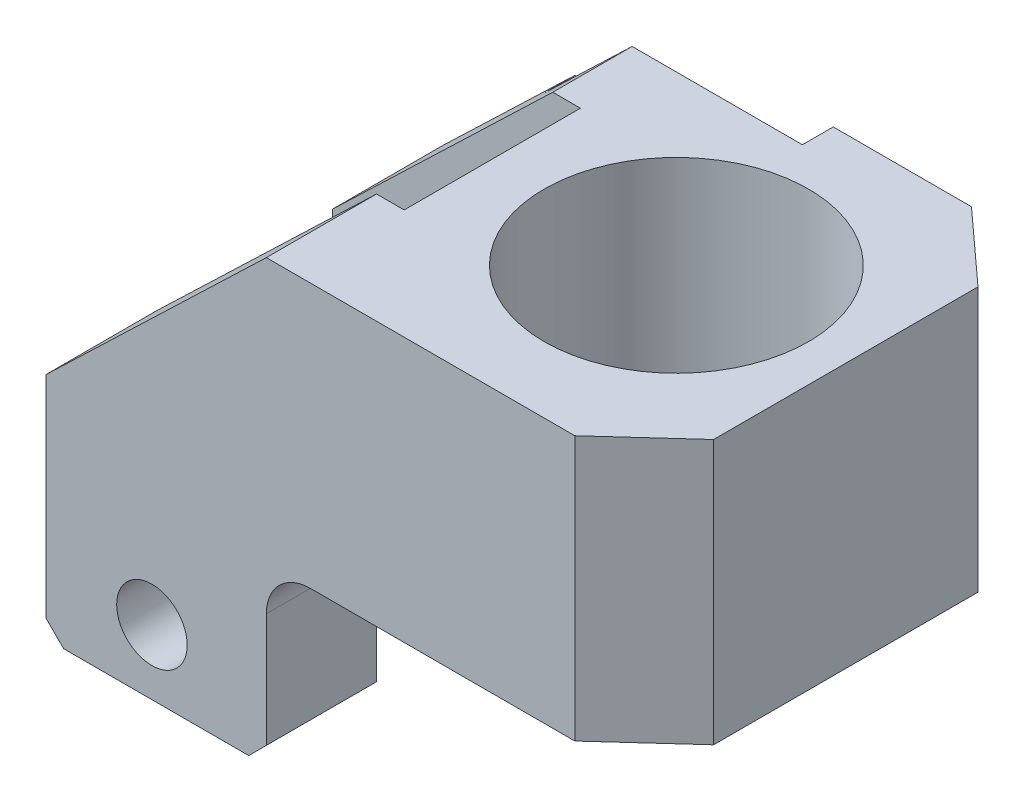
ISO-10303-21;
HEADER;
FILE_DESCRIPTION(('STEP AP214'),'2;1');
FILE_NAME('part.step','',(''),(''),'','','');
FILE_SCHEMA(('AUTOMOTIVE_DESIGN { 1 0 10303 214 1 1 1 1 }'));
ENDSEC;
DATA;
#1=APPLICATION_CONTEXT('core data for automotive mechanical design processes');
#2=APPLICATION_PROTOCOL_DEFINITION('international standard','automotive_design',2000,#1);
#3=PRODUCT_CONTEXT('',#1,'mechanical');
#4=PRODUCT('Part','Part','',(#3));
#5=PRODUCT_RELATED_PRODUCT_CATEGORY('part','',(#4));
#6=PRODUCT_DEFINITION_FORMATION('','',#4);
#7=PRODUCT_DEFINITION_CONTEXT('part definition',#1,'design');
#8=PRODUCT_DEFINITION('design','',#6,#7);
#9=PRODUCT_DEFINITION_SHAPE('','',#8);
#10=(LENGTH_UNIT() NAMED_UNIT(*) SI_UNIT(.MILLI.,.METRE.));
#11=(NAMED_UNIT(*) PLANE_ANGLE_UNIT() SI_UNIT($,.RADIAN.));
#12=(NAMED_UNIT(*) SI_UNIT($,.STERADIAN.) SOLID_ANGLE_UNIT());
#13=UNCERTAINTY_MEASURE_WITH_UNIT(LENGTH_MEASURE(1.E-05),#10,'distance_accuracy_value','');
#14=(GEOMETRIC_REPRESENTATION_CONTEXT(3) GLOBAL_UNCERTAINTY_ASSIGNED_CONTEXT((#13)) GLOBAL_UNIT_ASSIGNED_CONTEXT((#10,
#11,#12)) REPRESENTATION_CONTEXT('',''));
#15=CARTESIAN_POINT('',(0.,0.,0.));
#16=DIRECTION('',(0.,0.,1.));
#17=DIRECTION('',(1.,0.,0.));
#18=AXIS2_PLACEMENT_3D('',#15,#16,#17);
#19=CARTESIAN_POINT('',(-24.019063341913,30.,22.5));
#20=DIRECTION('',(-0.692343128271986,0.721568425538812,0.));
#21=DIRECTION('',(-0.721568425538812,-0.692343128271986,0.));
#22=AXIS2_PLACEMENT_3D('',#19,#20,#21);
#23=PLANE('',#22);
#24=DIRECTION('',(0.721568425538812,0.692343128271986,0.));
#25=VECTOR('',#24,1.);
#26=CARTESIAN_POINT('',(-24.019063341913,30.,10.));
#27=LINE('',#26,#25);
#28=CARTESIAN_POINT('',(-49.019063341913,6.01256153375207,10.));
#29=VERTEX_POINT('',#28);
#30=CARTESIAN_POINT('',(-24.019063341913,30.,10.));
#31=VERTEX_POINT('',#30);
#32=EDGE_CURVE('E338',#29,#31,#27,.T.);
#33=ORIENTED_EDGE('',*,*,#32,.F.);
#34=DIRECTION('',(0.,0.,-1.));
#35=VECTOR('',#34,1.);
#36=CARTESIAN_POINT('',(-49.019063341913,6.01256153375207,22.5));
#37=LINE('',#36,#35);
#38=CARTESIAN_POINT('',(-49.019063341913,6.01256153375207,22.5));
#39=VERTEX_POINT('',#38);
#40=EDGE_CURVE('E373',#39,#29,#37,.T.);
#41=ORIENTED_EDGE('',*,*,#40,.F.);
#42=DIRECTION('',(0.721568425538812,0.692343128271986,0.));
#43=VECTOR('',#42,1.);
#44=CARTESIAN_POINT('',(-24.019063341913,30.,22.5));
#45=LINE('',#44,#43);
#46=CARTESIAN_POINT('',(-24.019063341913,30.,22.5));
#47=VERTEX_POINT('',#46);
#48=EDGE_CURVE('E346',#39,#47,#45,.T.);
#49=ORIENTED_EDGE('',*,*,#48,.T.);
#50=DIRECTION('',(0.,0.,1.));
#51=VECTOR('',#50,1.);
#52=CARTESIAN_POINT('',(-24.019063341913,30.,-22.5));
#53=LINE('',#52,#51);
#54=EDGE_CURVE('E208',#31,#47,#53,.T.);
#55=ORIENTED_EDGE('',*,*,#54,.F.);
#56=EDGE_LOOP('',(#33,#41,#49,#55));
#57=FACE_BOUND('',#56,.T.);
#58=ADVANCED_FACE('F30',(#57),#23,.T.);
#59=CARTESIAN_POINT('',(-49.019063341913,-19.9275306984768,22.5));
#60=DIRECTION('',(-1.,0.,0.));
#61=DIRECTION('',(0.,0.,1.));
#62=AXIS2_PLACEMENT_3D('',#59,#60,#61);
#63=PLANE('',#62);
#64=DIRECTION('',(0.,1.,0.));
#65=VECTOR('',#64,1.);
#66=CARTESIAN_POINT('',(-49.019063341913,-19.9275306984768,10.));
#67=LINE('',#66,#65);
#68=CARTESIAN_POINT('',(-49.019063341913,-17.9275306984768,10.));
#69=VERTEX_POINT('',#68);
#70=EDGE_CURVE('E336',#69,#29,#67,.T.);
#71=ORIENTED_EDGE('',*,*,#70,.F.);
#72=DIRECTION('',(0.,0.,1.));
#73=VECTOR('',#72,1.);
#74=CARTESIAN_POINT('',(-49.019063341913,-17.9275306984768,22.5));
#75=LINE('',#74,#73);
#76=CARTESIAN_POINT('',(-49.019063341913,-17.9275306984768,22.5));
#77=VERTEX_POINT('',#76);
#78=EDGE_CURVE('E52',#69,#77,#75,.T.);
#79=ORIENTED_EDGE('',*,*,#78,.T.);
#80=DIRECTION('',(0.,1.,0.));
#81=VECTOR('',#80,1.);
#82=CARTESIAN_POINT('',(-49.019063341913,-19.9275306984768,22.5));
#83=LINE('',#82,#81);
#84=EDGE_CURVE('E430',#77,#39,#83,.T.);
#85=ORIENTED_EDGE('',*,*,#84,.T.);
#86=ORIENTED_EDGE('',*,*,#40,.T.);
#87=EDGE_LOOP('',(#71,#79,#85,#86));
#88=FACE_BOUND('',#87,.T.);
#89=ADVANCED_FACE('F447',(#88),#63,.T.);
#90=CARTESIAN_POINT('',(-49.019063341913,-19.9275306984768,22.5));
#91=DIRECTION('',(0.,-1.,0.));
#92=DIRECTION('',(0.,0.,-1.));
#93=AXIS2_PLACEMENT_3D('',#90,#91,#92);
#94=PLANE('',#93);
#95=DIRECTION('',(-1.,0.,0.));
#96=VECTOR('',#95,1.);
#97=CARTESIAN_POINT('',(-49.019063341913,-19.9275306984768,10.));
#98=LINE('',#97,#96);
#99=CARTESIAN_POINT('',(-26.019063341913,-19.9275306984768,10.));
#100=VERTEX_POINT('',#99);
#101=CARTESIAN_POINT('',(-47.019063341913,-19.9275306984768,10.));
#102=VERTEX_POINT('',#101);
#103=EDGE_CURVE('E333',#100,#102,#98,.T.);
#104=ORIENTED_EDGE('',*,*,#103,.F.);
#105=DIRECTION('',(0.,0.,1.));
#106=VECTOR('',#105,1.);
#107=CARTESIAN_POINT('',(-26.019063341913,-19.9275306984768,22.5));
#108=LINE('',#107,#106);
#109=CARTESIAN_POINT('',(-26.019063341913,-19.9275306984768,22.5));
#110=VERTEX_POINT('',#109);
#111=EDGE_CURVE('E289',#100,#110,#108,.T.);
#112=ORIENTED_EDGE('',*,*,#111,.T.);
#113=DIRECTION('',(-1.,0.,0.));
#114=VECTOR('',#113,1.);
#115=CARTESIAN_POINT('',(-49.019063341913,-19.9275306984768,22.5));
#116=LINE('',#115,#114);
#117=CARTESIAN_POINT('',(-47.019063341913,-19.9275306984768,22.5));
#118=VERTEX_POINT('',#117);
#119=EDGE_CURVE('E353',#110,#118,#116,.T.);
#120=ORIENTED_EDGE('',*,*,#119,.T.);
#121=DIRECTION('',(0.,0.,-1.));
#122=VECTOR('',#121,1.);
#123=CARTESIAN_POINT('',(-47.019063341913,-19.9275306984768,22.5));
#124=LINE('',#123,#122);
#125=EDGE_CURVE('E286',#118,#102,#124,.T.);
#126=ORIENTED_EDGE('',*,*,#125,.T.);
#127=EDGE_LOOP('',(#104,#112,#120,#126));
#128=FACE_BOUND('',#127,.T.);
#129=ADVANCED_FACE('F437',(#128),#94,.T.);
#130=CARTESIAN_POINT('',(-24.019063341913,-19.9275306984768,22.5));
#131=DIRECTION('',(1.,0.,0.));
#132=DIRECTION('',(0.,0.,-1.));
#133=AXIS2_PLACEMENT_3D('',#130,#131,#132);
#134=PLANE('',#133);
#135=DIRECTION('',(0.,-1.,0.));
#136=VECTOR('',#135,1.);
#137=CARTESIAN_POINT('',(-24.019063341913,-19.9275306984768,22.5));
#138=LINE('',#137,#136);
#139=CARTESIAN_POINT('',(-24.019063341913,-5.,22.5));
#140=VERTEX_POINT('',#139);
#141=CARTESIAN_POINT('',(-24.019063341913,-17.9275306984768,22.5));
#142=VERTEX_POINT('',#141);
#143=EDGE_CURVE('E349',#140,#142,#138,.T.);
#144=ORIENTED_EDGE('',*,*,#143,.T.);
#145=DIRECTION('',(0.,0.,-1.));
#146=VECTOR('',#145,1.);
#147=CARTESIAN_POINT('',(-24.019063341913,-17.9275306984768,22.5));
#148=LINE('',#147,#146);
#149=CARTESIAN_POINT('',(-24.019063341913,-17.9275306984768,10.));
#150=VERTEX_POINT('',#149);
#151=EDGE_CURVE('E279',#142,#150,#148,.T.);
#152=ORIENTED_EDGE('',*,*,#151,.T.);
#153=DIRECTION('',(0.,-1.,0.));
#154=VECTOR('',#153,1.);
#155=CARTESIAN_POINT('',(-24.019063341913,-19.9275306984768,10.));
#156=LINE('',#155,#154);
#157=CARTESIAN_POINT('',(-24.019063341913,-5.,10.));
#158=VERTEX_POINT('',#157);
#159=EDGE_CURVE('E360',#158,#150,#156,.T.);
#160=ORIENTED_EDGE('',*,*,#159,.F.);
#161=DIRECTION('',(0.,0.,-1.));
#162=VECTOR('',#161,1.);
#163=CARTESIAN_POINT('',(-24.019063341913,-5.,16.25));
#164=LINE('',#163,#162);
#165=EDGE_CURVE('E247',#158,#140,#164,.F.);
#166=ORIENTED_EDGE('',*,*,#165,.T.);
#167=EDGE_LOOP('',(#144,#152,#160,#166));
#168=FACE_BOUND('',#167,.T.);
#169=ADVANCED_FACE('F460',(#168),#134,.T.);
#170=CARTESIAN_POINT('',(10.9809366580871,30.,22.5));
#171=DIRECTION('',(-0.67300654170394,0.,-0.739636528859752));
#172=DIRECTION('',(-0.739636528859752,0.,0.67300654170394));
#173=AXIS2_PLACEMENT_3D('',#170,#171,#172);
#174=PLANE('',#173);
#175=DIRECTION('',(0.739636528859752,0.,-0.67300654170394));
#176=VECTOR('',#175,1.);
#177=CARTESIAN_POINT('',(10.9809366580871,0.,22.5));
#178=LINE('',#177,#176);
#179=CARTESIAN_POINT('',(10.9809366580871,0.,22.5));
#180=VERTEX_POINT('',#179);
#181=CARTESIAN_POINT('',(19.2234627298298,0.,15.));
#182=VERTEX_POINT('',#181);
#183=EDGE_CURVE('E219',#180,#182,#178,.T.);
#184=ORIENTED_EDGE('',*,*,#183,.T.);
#185=DIRECTION('',(0.,-1.,0.));
#186=VECTOR('',#185,1.);
#187=CARTESIAN_POINT('',(19.2234627298298,30.,15.));
#188=LINE('',#187,#186);
#189=CARTESIAN_POINT('',(19.2234627298298,30.,15.));
#190=VERTEX_POINT('',#189);
#191=EDGE_CURVE('E235',#190,#182,#188,.T.);
#192=ORIENTED_EDGE('',*,*,#191,.F.);
#193=DIRECTION('',(0.739636528859752,0.,-0.67300654170394));
#194=VECTOR('',#193,1.);
#195=CARTESIAN_POINT('',(10.9809366580871,30.,22.5));
#196=LINE('',#195,#194);
#197=CARTESIAN_POINT('',(10.9809366580871,30.,22.5));
#198=VERTEX_POINT('',#197);
#199=EDGE_CURVE('E246',#198,#190,#196,.T.);
#200=ORIENTED_EDGE('',*,*,#199,.F.);
#201=DIRECTION('',(0.,-1.,0.));
#202=VECTOR('',#201,1.);
#203=CARTESIAN_POINT('',(10.9809366580871,30.,22.5));
#204=LINE('',#203,#202);
#205=EDGE_CURVE('E218',#198,#180,#204,.T.);
#206=ORIENTED_EDGE('',*,*,#205,.T.);
#207=EDGE_LOOP('',(#184,#192,#200,#206));
#208=FACE_BOUND('',#207,.T.);
#209=ADVANCED_FACE('F517',(#208),#174,.F.);
#210=CARTESIAN_POINT('',(19.2234627298298,30.,-15.));
#211=DIRECTION('',(-1.,0.,0.));
#212=DIRECTION('',(0.,0.,1.));
#213=AXIS2_PLACEMENT_3D('',#210,#211,#212);
#214=PLANE('',#213);
#215=DIRECTION('',(0.,0.,-1.));
#216=VECTOR('',#215,1.);
#217=CARTESIAN_POINT('',(19.2234627298298,0.,-15.));
#218=LINE('',#217,#216);
#219=CARTESIAN_POINT('',(19.2234627298298,0.,-15.));
#220=VERTEX_POINT('',#219);
#221=EDGE_CURVE('E222',#182,#220,#218,.T.);
#222=ORIENTED_EDGE('',*,*,#221,.T.);
#223=DIRECTION('',(0.,-1.,0.));
#224=VECTOR('',#223,1.);
#225=CARTESIAN_POINT('',(19.2234627298298,30.,-15.));
#226=LINE('',#225,#224);
#227=CARTESIAN_POINT('',(19.2234627298298,30.,-15.));
#228=VERTEX_POINT('',#227);
#229=EDGE_CURVE('E232',#228,#220,#226,.T.);
#230=ORIENTED_EDGE('',*,*,#229,.F.);
#231=DIRECTION('',(0.,0.,-1.));
#232=VECTOR('',#231,1.);
#233=CARTESIAN_POINT('',(19.2234627298298,30.,-15.));
#234=LINE('',#233,#232);
#235=EDGE_CURVE('E212',#190,#228,#234,.T.);
#236=ORIENTED_EDGE('',*,*,#235,.F.);
#237=ORIENTED_EDGE('',*,*,#191,.T.);
#238=EDGE_LOOP('',(#222,#230,#236,#237));
#239=FACE_BOUND('',#238,.T.);
#240=ADVANCED_FACE('F387',(#239),#214,.F.);
#241=CARTESIAN_POINT('',(10.9809366580871,30.,-22.5));
#242=DIRECTION('',(-0.67300654170394,0.,0.739636528859752));
#243=DIRECTION('',(0.739636528859752,0.,0.67300654170394));
#244=AXIS2_PLACEMENT_3D('',#241,#242,#243);
#245=PLANE('',#244);
#246=DIRECTION('',(-0.739636528859752,0.,-0.67300654170394));
#247=VECTOR('',#246,1.);
#248=CARTESIAN_POINT('',(10.9809366580871,0.,-22.5));
#249=LINE('',#248,#247);
#250=CARTESIAN_POINT('',(10.9809366580871,0.,-22.5));
#251=VERTEX_POINT('',#250);
#252=EDGE_CURVE('E225',#220,#251,#249,.T.);
#253=ORIENTED_EDGE('',*,*,#252,.T.);
#254=DIRECTION('',(0.,-1.,0.));
#255=VECTOR('',#254,1.);
#256=CARTESIAN_POINT('',(10.9809366580871,30.,-22.5));
#257=LINE('',#256,#255);
#258=CARTESIAN_POINT('',(10.9809366580871,30.,-22.5));
#259=VERTEX_POINT('',#258);
#260=EDGE_CURVE('E230',#259,#251,#257,.T.);
#261=ORIENTED_EDGE('',*,*,#260,.F.);
#262=DIRECTION('',(-0.739636528859752,0.,-0.67300654170394));
#263=VECTOR('',#262,1.);
#264=CARTESIAN_POINT('',(10.9809366580871,30.,-22.5));
#265=LINE('',#264,#263);
#266=EDGE_CURVE('E206',#228,#259,#265,.T.);
#267=ORIENTED_EDGE('',*,*,#266,.F.);
#268=ORIENTED_EDGE('',*,*,#229,.T.);
#269=EDGE_LOOP('',(#253,#261,#267,#268));
#270=FACE_BOUND('',#269,.T.);
#271=ADVANCED_FACE('F390',(#270),#245,.F.);
#272=CARTESIAN_POINT('',(-24.019063341913,30.,-22.5));
#273=DIRECTION('',(0.,0.,1.));
#274=DIRECTION('',(1.,0.,0.));
#275=AXIS2_PLACEMENT_3D('',#272,#273,#274);
#276=PLANE('',#275);
#277=CARTESIAN_POINT('',(-37.0000000016137,-12.5783063820862,-22.5));
#278=DIRECTION('',(0.,0.,-1.));
#279=DIRECTION('',(-1.,0.,0.));
#280=AXIS2_PLACEMENT_3D('',#277,#278,#279);
#281=CIRCLE('',#280,3.99999999676854);
#282=CARTESIAN_POINT('',(-40.9999999983823,-12.5783063820862,-22.5));
#283=VERTEX_POINT('',#282);
#284=EDGE_CURVE('E192',#283,#283,#281,.T.);
#285=ORIENTED_EDGE('',*,*,#284,.F.);
#286=EDGE_LOOP('',(#285));
#287=FACE_BOUND('',#286,.T.);
#288=DIRECTION('',(0.721568425538812,0.692343128271986,0.));
#289=VECTOR('',#288,1.);
#290=CARTESIAN_POINT('',(-24.019063341913,30.,-22.5));
#291=LINE('',#290,#289);
#292=CARTESIAN_POINT('',(-49.019063341913,6.01256153375207,-22.5));
#293=VERTEX_POINT('',#292);
#294=CARTESIAN_POINT('',(-33.9839867005009,20.4386805645998,-22.5));
#295=VERTEX_POINT('',#294);
#296=EDGE_CURVE('E202',#293,#295,#291,.T.);
#297=ORIENTED_EDGE('',*,*,#296,.T.);
#298=CARTESIAN_POINT('',(-21.5760087804677,32.0594414663638,-22.5));
#299=DIRECTION('',(0.,0.,-1.));
#300=DIRECTION('',(-1.,0.,0.));
#301=AXIS2_PLACEMENT_3D('',#298,#299,#300);
#302=CIRCLE('',#301,17.);
#303=CARTESIAN_POINT('',(-4.70121394181491,30.,-22.5));
#304=VERTEX_POINT('',#303);
#305=EDGE_CURVE('E187',#304,#295,#302,.T.);
#306=ORIENTED_EDGE('',*,*,#305,.F.);
#307=DIRECTION('',(-1.,0.,0.));
#308=VECTOR('',#307,1.);
#309=CARTESIAN_POINT('',(-24.019063341913,30.,-22.5));
#310=LINE('',#309,#308);
#311=EDGE_CURVE('E200',#259,#304,#310,.T.);
#312=ORIENTED_EDGE('',*,*,#311,.F.);
#313=ORIENTED_EDGE('',*,*,#260,.T.);
#314=DIRECTION('',(-1.,0.,0.));
#315=VECTOR('',#314,1.);
#316=CARTESIAN_POINT('',(-24.019063341913,0.,-22.5));
#317=LINE('',#316,#315);
#318=CARTESIAN_POINT('',(-19.019063341913,0.,-22.5));
#319=VERTEX_POINT('',#318);
#320=EDGE_CURVE('E227',#251,#319,#317,.T.);
#321=ORIENTED_EDGE('',*,*,#320,.T.);
#322=CARTESIAN_POINT('',(-19.019063341913,-5.,-22.5));
#323=DIRECTION('',(0.,0.,1.));
#324=DIRECTION('',(1.,0.,0.));
#325=AXIS2_PLACEMENT_3D('',#322,#323,#324);
#326=CIRCLE('',#325,5.);
#327=CARTESIAN_POINT('',(-24.019063341913,-5.,-22.5));
#328=VERTEX_POINT('',#327);
#329=EDGE_CURVE('E261',#319,#328,#326,.T.);
#330=ORIENTED_EDGE('',*,*,#329,.T.);
#331=DIRECTION('',(0.,-1.,0.));
#332=VECTOR('',#331,1.);
#333=CARTESIAN_POINT('',(-24.019063341913,-19.9275306984768,-22.5));
#334=LINE('',#333,#332);
#335=CARTESIAN_POINT('',(-24.019063341913,-17.9275306984768,-22.5));
#336=VERTEX_POINT('',#335);
#337=EDGE_CURVE('E361',#328,#336,#334,.T.);
#338=ORIENTED_EDGE('',*,*,#337,.T.);
#339=DIRECTION('',(0.707106781186551,0.707106781186544,0.));
#340=VECTOR('',#339,1.);
#341=CARTESIAN_POINT('',(-24.019063341913,-17.9275306984768,-22.5));
#342=LINE('',#341,#340);
#343=CARTESIAN_POINT('',(-26.019063341913,-19.9275306984768,-22.5));
#344=VERTEX_POINT('',#343);
#345=EDGE_CURVE('E268',#336,#344,#342,.F.);
#346=ORIENTED_EDGE('',*,*,#345,.T.);
#347=DIRECTION('',(-1.,0.,0.));
#348=VECTOR('',#347,1.);
#349=CARTESIAN_POINT('',(-49.019063341913,-19.9275306984768,-22.5));
#350=LINE('',#349,#348);
#351=CARTESIAN_POINT('',(-47.019063341913,-19.9275306984768,-22.5));
#352=VERTEX_POINT('',#351);
#353=EDGE_CURVE('E365',#344,#352,#350,.T.);
#354=ORIENTED_EDGE('',*,*,#353,.T.);
#355=DIRECTION('',(0.707106781186545,-0.70710678118655,0.));
#356=VECTOR('',#355,1.);
#357=CARTESIAN_POINT('',(-47.019063341913,-19.9275306984768,-22.5));
#358=LINE('',#357,#356);
#359=CARTESIAN_POINT('',(-49.019063341913,-17.9275306984768,-22.5));
#360=VERTEX_POINT('',#359);
#361=EDGE_CURVE('E266',#352,#360,#358,.F.);
#362=ORIENTED_EDGE('',*,*,#361,.T.);
#363=DIRECTION('',(0.,1.,0.));
#364=VECTOR('',#363,1.);
#365=CARTESIAN_POINT('',(-49.019063341913,-19.9275306984768,-22.5));
#366=LINE('',#365,#364);
#367=EDGE_CURVE('E350',#360,#293,#366,.T.);
#368=ORIENTED_EDGE('',*,*,#367,.T.);
#369=EDGE_LOOP('',(#297,#306,#312,#313,#321,#330,#338,#346,#354,#362,#368));
#370=FACE_BOUND('',#369,.T.);
#371=ADVANCED_FACE('F198',(#287,#370),#276,.F.);
#372=CARTESIAN_POINT('',(-24.019063341913,30.,22.5));
#373=DIRECTION('',(0.,0.,-1.));
#374=DIRECTION('',(-1.,0.,0.));
#375=AXIS2_PLACEMENT_3D('',#372,#373,#374);
#376=PLANE('',#375);
#377=CARTESIAN_POINT('',(-37.0000000016137,-12.5783063820862,22.5));
#378=DIRECTION('',(0.,0.,-1.));
#379=DIRECTION('',(-1.,0.,0.));
#380=AXIS2_PLACEMENT_3D('',#377,#378,#379);
#381=CIRCLE('',#380,3.99999999676854);
#382=CARTESIAN_POINT('',(-40.9999999983823,-12.5783063820862,22.5));
#383=VERTEX_POINT('',#382);
#384=EDGE_CURVE('E314',#383,#383,#381,.T.);
#385=ORIENTED_EDGE('',*,*,#384,.T.);
#386=EDGE_LOOP('',(#385));
#387=FACE_BOUND('',#386,.T.);
#388=ORIENTED_EDGE('',*,*,#119,.F.);
#389=DIRECTION('',(-0.707106781186551,-0.707106781186544,0.));
#390=VECTOR('',#389,1.);
#391=CARTESIAN_POINT('',(-24.019063341913,-17.9275306984768,22.5));
#392=LINE('',#391,#390);
#393=EDGE_CURVE('E293',#110,#142,#392,.F.);
#394=ORIENTED_EDGE('',*,*,#393,.T.);
#395=ORIENTED_EDGE('',*,*,#143,.F.);
#396=CARTESIAN_POINT('',(-19.019063341913,-5.,22.5));
#397=DIRECTION('',(0.,0.,-1.));
#398=DIRECTION('',(-1.,0.,0.));
#399=AXIS2_PLACEMENT_3D('',#396,#397,#398);
#400=CIRCLE('',#399,5.);
#401=CARTESIAN_POINT('',(-19.019063341913,0.,22.5));
#402=VERTEX_POINT('',#401);
#403=EDGE_CURVE('E259',#140,#402,#400,.T.);
#404=ORIENTED_EDGE('',*,*,#403,.T.);
#405=DIRECTION('',(1.,0.,0.));
#406=VECTOR('',#405,1.);
#407=CARTESIAN_POINT('',(-24.019063341913,0.,22.5));
#408=LINE('',#407,#406);
#409=EDGE_CURVE('E243',#402,#180,#408,.T.);
#410=ORIENTED_EDGE('',*,*,#409,.T.);
#411=ORIENTED_EDGE('',*,*,#205,.F.);
#412=DIRECTION('',(1.,0.,0.));
#413=VECTOR('',#412,1.);
#414=CARTESIAN_POINT('',(-24.019063341913,30.,22.5));
#415=LINE('',#414,#413);
#416=EDGE_CURVE('E216',#47,#198,#415,.T.);
#417=ORIENTED_EDGE('',*,*,#416,.F.);
#418=ORIENTED_EDGE('',*,*,#48,.F.);
#419=ORIENTED_EDGE('',*,*,#84,.F.);
#420=DIRECTION('',(-0.707106781186545,0.70710678118655,0.));
#421=VECTOR('',#420,1.);
#422=CARTESIAN_POINT('',(-47.019063341913,-19.9275306984768,22.5));
#423=LINE('',#422,#421);
#424=EDGE_CURVE('E291',#77,#118,#423,.F.);
#425=ORIENTED_EDGE('',*,*,#424,.T.);
#426=EDGE_LOOP('',(#388,#394,#395,#404,#410,#411,#417,#418,#419,#425));
#427=FACE_BOUND('',#426,.T.);
#428=ADVANCED_FACE('F452',(#387,#427),#376,.F.);
#429=CARTESIAN_POINT('',(35.7085148733153,30.,0.));
#430=DIRECTION('',(0.,-1.,0.));
#431=DIRECTION('',(0.,0.,-1.));
#432=AXIS2_PLACEMENT_3D('',#429,#430,#431);
#433=PLANE('',#432);
#434=CARTESIAN_POINT('',(0.,30.,0.));
#435=DIRECTION('',(0.,1.,0.));
#436=DIRECTION('',(0.,0.,1.));
#437=AXIS2_PLACEMENT_3D('',#434,#435,#436);
#438=CIRCLE('',#437,15.);
#439=CARTESIAN_POINT('',(0.,30.,15.));
#440=VERTEX_POINT('',#439);
#441=EDGE_CURVE('E376',#440,#440,#438,.T.);
#442=ORIENTED_EDGE('',*,*,#441,.F.);
#443=EDGE_LOOP('',(#442));
#444=FACE_BOUND('',#443,.T.);
#445=ORIENTED_EDGE('',*,*,#311,.T.);
#446=DIRECTION('',(0.,0.,-1.));
#447=VECTOR('',#446,1.);
#448=CARTESIAN_POINT('',(-4.70121394181491,30.,-19.));
#449=LINE('',#448,#447);
#450=CARTESIAN_POINT('',(-4.70121394181491,30.,-19.));
#451=VERTEX_POINT('',#450);
#452=EDGE_CURVE('E184',#304,#451,#449,.F.);
#453=ORIENTED_EDGE('',*,*,#452,.T.);
#454=DIRECTION('',(1.,0.,0.));
#455=VECTOR('',#454,1.);
#456=CARTESIAN_POINT('',(35.7085148733153,30.,-19.));
#457=LINE('',#456,#455);
#458=CARTESIAN_POINT('',(-24.019063341913,30.,-19.));
#459=VERTEX_POINT('',#458);
#460=EDGE_CURVE('E193',#459,#451,#457,.T.);
#461=ORIENTED_EDGE('',*,*,#460,.F.);
#462=CARTESIAN_POINT('',(-24.019063341913,30.,-10.));
#463=VERTEX_POINT('',#462);
#464=EDGE_CURVE('E210',#459,#463,#53,.T.);
#465=ORIENTED_EDGE('',*,*,#464,.T.);
#466=DIRECTION('',(1.,0.,0.));
#467=VECTOR('',#466,1.);
#468=CARTESIAN_POINT('',(35.7085148733153,30.,-10.));
#469=LINE('',#468,#467);
#470=CARTESIAN_POINT('',(-20.8824295978616,30.,-10.));
#471=VERTEX_POINT('',#470);
#472=EDGE_CURVE('E331',#463,#471,#469,.T.);
#473=ORIENTED_EDGE('',*,*,#472,.T.);
#474=DIRECTION('',(0.,0.,1.));
#475=VECTOR('',#474,1.);
#476=CARTESIAN_POINT('',(-20.8824295978616,30.,0.));
#477=LINE('',#476,#475);
#478=CARTESIAN_POINT('',(-20.8824295978616,30.,10.));
#479=VERTEX_POINT('',#478);
#480=EDGE_CURVE('E343',#471,#479,#477,.T.);
#481=ORIENTED_EDGE('',*,*,#480,.T.);
#482=DIRECTION('',(-1.,0.,0.));
#483=VECTOR('',#482,1.);
#484=CARTESIAN_POINT('',(35.7085148733153,30.,10.));
#485=LINE('',#484,#483);
#486=EDGE_CURVE('E340',#479,#31,#485,.T.);
#487=ORIENTED_EDGE('',*,*,#486,.T.);
#488=ORIENTED_EDGE('',*,*,#54,.T.);
#489=ORIENTED_EDGE('',*,*,#416,.T.);
#490=ORIENTED_EDGE('',*,*,#199,.T.);
#491=ORIENTED_EDGE('',*,*,#235,.T.);
#492=ORIENTED_EDGE('',*,*,#266,.T.);
#493=EDGE_LOOP('',(#445,#453,#461,#465,#473,#481,#487,#488,#489,#490,#491,#492));
#494=FACE_BOUND('',#493,.T.);
#495=ADVANCED_FACE('F204',(#444,#494),#433,.F.);
#496=CARTESIAN_POINT('',(35.7085148733153,0.,0.));
#497=DIRECTION('',(0.,-1.,0.));
#498=DIRECTION('',(0.,0.,-1.));
#499=AXIS2_PLACEMENT_3D('',#496,#497,#498);
#500=PLANE('',#499);
#501=ORIENTED_EDGE('',*,*,#409,.F.);
#502=DIRECTION('',(0.,0.,1.));
#503=VECTOR('',#502,1.);
#504=CARTESIAN_POINT('',(-19.019063341913,0.,-22.5));
#505=LINE('',#504,#503);
#506=EDGE_CURVE('E249',#402,#319,#505,.F.);
#507=ORIENTED_EDGE('',*,*,#506,.T.);
#508=ORIENTED_EDGE('',*,*,#320,.F.);
#509=ORIENTED_EDGE('',*,*,#252,.F.);
#510=ORIENTED_EDGE('',*,*,#221,.F.);
#511=ORIENTED_EDGE('',*,*,#183,.F.);
#512=EDGE_LOOP('',(#501,#507,#508,#509,#510,#511));
#513=FACE_BOUND('',#512,.T.);
#514=CARTESIAN_POINT('',(0.,0.,0.));
#515=DIRECTION('',(0.,1.,0.));
#516=DIRECTION('',(0.,0.,1.));
#517=AXIS2_PLACEMENT_3D('',#514,#515,#516);
#518=CIRCLE('',#517,15.);
#519=CARTESIAN_POINT('',(0.,0.,15.));
#520=VERTEX_POINT('',#519);
#521=EDGE_CURVE('E223',#520,#520,#518,.T.);
#522=ORIENTED_EDGE('',*,*,#521,.T.);
#523=EDGE_LOOP('',(#522));
#524=FACE_BOUND('',#523,.T.);
#525=ADVANCED_FACE('F396',(#513,#524),#500,.T.);
#526=CARTESIAN_POINT('',(0.,0.,0.));
#527=DIRECTION('',(0.,1.,0.));
#528=DIRECTION('',(0.,0.,1.));
#529=AXIS2_PLACEMENT_3D('',#526,#527,#528);
#530=CYLINDRICAL_SURFACE('',#529,15.);
#531=ORIENTED_EDGE('',*,*,#521,.F.);
#532=EDGE_LOOP('',(#531));
#533=FACE_BOUND('',#532,.T.);
#534=ORIENTED_EDGE('',*,*,#441,.T.);
#535=EDGE_LOOP('',(#534));
#536=FACE_BOUND('',#535,.T.);
#537=ADVANCED_FACE('F491',(#533,#536),#530,.F.);
#538=DIRECTION('',(0.,0.,-1.));
#539=VECTOR('',#538,1.);
#540=CARTESIAN_POINT('',(-33.9839867005009,20.4386805645998,-19.));
#541=LINE('',#540,#539);
#542=CARTESIAN_POINT('',(-33.9839867005009,20.4386805645998,-19.));
#543=VERTEX_POINT('',#542);
#544=EDGE_CURVE('E11',#295,#543,#541,.F.);
#545=ORIENTED_EDGE('',*,*,#544,.F.);
#546=ORIENTED_EDGE('',*,*,#296,.F.);
#547=CARTESIAN_POINT('',(-49.019063341913,6.01256153375207,-10.));
#548=VERTEX_POINT('',#547);
#549=EDGE_CURVE('E377',#548,#293,#37,.T.);
#550=ORIENTED_EDGE('',*,*,#549,.F.);
#551=DIRECTION('',(-0.721568425538812,-0.692343128271986,0.));
#552=VECTOR('',#551,1.);
#553=CARTESIAN_POINT('',(-24.019063341913,30.,-10.));
#554=LINE('',#553,#552);
#555=EDGE_CURVE('E329',#463,#548,#554,.T.);
#556=ORIENTED_EDGE('',*,*,#555,.F.);
#557=ORIENTED_EDGE('',*,*,#464,.F.);
#558=DIRECTION('',(-0.721568425538812,-0.692343128271986,0.));
#559=VECTOR('',#558,1.);
#560=CARTESIAN_POINT('',(-24.019063341913,30.,-19.));
#561=LINE('',#560,#559);
#562=EDGE_CURVE('E38',#459,#543,#561,.T.);
#563=ORIENTED_EDGE('',*,*,#562,.T.);
#564=EDGE_LOOP('',(#545,#546,#550,#556,#557,#563));
#565=FACE_BOUND('',#564,.T.);
#566=ADVANCED_FACE('F300',(#565),#23,.T.);
#567=ORIENTED_EDGE('',*,*,#367,.F.);
#568=DIRECTION('',(0.,0.,1.));
#569=VECTOR('',#568,1.);
#570=CARTESIAN_POINT('',(-49.019063341913,-17.9275306984768,22.5));
#571=LINE('',#570,#569);
#572=CARTESIAN_POINT('',(-49.019063341913,-17.9275306984768,-10.));
#573=VERTEX_POINT('',#572);
#574=EDGE_CURVE('E295',#360,#573,#571,.T.);
#575=ORIENTED_EDGE('',*,*,#574,.T.);
#576=DIRECTION('',(0.,-1.,0.));
#577=VECTOR('',#576,1.);
#578=CARTESIAN_POINT('',(-49.019063341913,-19.9275306984768,-10.));
#579=LINE('',#578,#577);
#580=EDGE_CURVE('E326',#548,#573,#579,.T.);
#581=ORIENTED_EDGE('',*,*,#580,.F.);
#582=ORIENTED_EDGE('',*,*,#549,.T.);
#583=EDGE_LOOP('',(#567,#575,#581,#582));
#584=FACE_BOUND('',#583,.T.);
#585=ADVANCED_FACE('F427',(#584),#63,.T.);
#586=ORIENTED_EDGE('',*,*,#353,.F.);
#587=DIRECTION('',(0.,0.,1.));
#588=VECTOR('',#587,1.);
#589=CARTESIAN_POINT('',(-26.019063341913,-19.9275306984768,22.5));
#590=LINE('',#589,#588);
#591=CARTESIAN_POINT('',(-26.019063341913,-19.9275306984768,-10.));
#592=VERTEX_POINT('',#591);
#593=EDGE_CURVE('E273',#344,#592,#590,.T.);
#594=ORIENTED_EDGE('',*,*,#593,.T.);
#595=DIRECTION('',(1.,0.,0.));
#596=VECTOR('',#595,1.);
#597=CARTESIAN_POINT('',(-49.019063341913,-19.9275306984768,-10.));
#598=LINE('',#597,#596);
#599=CARTESIAN_POINT('',(-47.019063341913,-19.9275306984768,-10.));
#600=VERTEX_POINT('',#599);
#601=EDGE_CURVE('E321',#600,#592,#598,.T.);
#602=ORIENTED_EDGE('',*,*,#601,.F.);
#603=DIRECTION('',(0.,0.,-1.));
#604=VECTOR('',#603,1.);
#605=CARTESIAN_POINT('',(-47.019063341913,-19.9275306984768,22.5));
#606=LINE('',#605,#604);
#607=EDGE_CURVE('E270',#600,#352,#606,.T.);
#608=ORIENTED_EDGE('',*,*,#607,.T.);
#609=EDGE_LOOP('',(#586,#594,#602,#608));
#610=FACE_BOUND('',#609,.T.);
#611=ADVANCED_FACE('F417',(#610),#94,.T.);
#612=DIRECTION('',(0.,1.,0.));
#613=VECTOR('',#612,1.);
#614=CARTESIAN_POINT('',(-24.019063341913,-19.9275306984768,-10.));
#615=LINE('',#614,#613);
#616=CARTESIAN_POINT('',(-24.019063341913,-17.9275306984768,-10.));
#617=VERTEX_POINT('',#616);
#618=CARTESIAN_POINT('',(-24.019063341913,-5.,-10.));
#619=VERTEX_POINT('',#618);
#620=EDGE_CURVE('E238',#617,#619,#615,.T.);
#621=ORIENTED_EDGE('',*,*,#620,.F.);
#622=DIRECTION('',(0.,0.,-1.));
#623=VECTOR('',#622,1.);
#624=CARTESIAN_POINT('',(-24.019063341913,-17.9275306984768,22.5));
#625=LINE('',#624,#623);
#626=EDGE_CURVE('E263',#617,#336,#625,.T.);
#627=ORIENTED_EDGE('',*,*,#626,.T.);
#628=ORIENTED_EDGE('',*,*,#337,.F.);
#629=DIRECTION('',(0.,0.,1.));
#630=VECTOR('',#629,1.);
#631=CARTESIAN_POINT('',(-24.019063341913,-5.,-10.));
#632=LINE('',#631,#630);
#633=EDGE_CURVE('E357',#328,#619,#632,.T.);
#634=ORIENTED_EDGE('',*,*,#633,.T.);
#635=EDGE_LOOP('',(#621,#627,#628,#634));
#636=FACE_BOUND('',#635,.T.);
#637=ADVANCED_FACE('F409',(#636),#134,.T.);
#638=CARTESIAN_POINT('',(-20.8824295978616,-30.,-10.));
#639=DIRECTION('',(1.,0.,0.));
#640=DIRECTION('',(0.,0.,-1.));
#641=AXIS2_PLACEMENT_3D('',#638,#639,#640);
#642=PLANE('',#641);
#643=DIRECTION('',(0.,1.,0.));
#644=VECTOR('',#643,1.);
#645=CARTESIAN_POINT('',(-20.8824295978616,-30.,-10.));
#646=LINE('',#645,#644);
#647=CARTESIAN_POINT('',(-20.8824295978616,-0.360186836068505,-10.));
#648=VERTEX_POINT('',#647);
#649=EDGE_CURVE('E317',#648,#471,#646,.T.);
#650=ORIENTED_EDGE('',*,*,#649,.F.);
#651=DIRECTION('',(0.,0.,-1.));
#652=VECTOR('',#651,1.);
#653=CARTESIAN_POINT('',(-20.8824295978616,-0.360186836068503,-10.));
#654=LINE('',#653,#652);
#655=CARTESIAN_POINT('',(-20.8824295978616,-0.360186836068505,10.));
#656=VERTEX_POINT('',#655);
#657=EDGE_CURVE('E254',#648,#656,#654,.F.);
#658=ORIENTED_EDGE('',*,*,#657,.T.);
#659=DIRECTION('',(0.,1.,0.));
#660=VECTOR('',#659,1.);
#661=CARTESIAN_POINT('',(-20.8824295978616,-30.,10.));
#662=LINE('',#661,#660);
#663=EDGE_CURVE('E318',#656,#479,#662,.T.);
#664=ORIENTED_EDGE('',*,*,#663,.T.);
#665=ORIENTED_EDGE('',*,*,#480,.F.);
#666=EDGE_LOOP('',(#650,#658,#664,#665));
#667=FACE_BOUND('',#666,.T.);
#668=ADVANCED_FACE('F455',(#667),#642,.F.);
#669=CARTESIAN_POINT('',(-65.5391185987355,-30.,10.));
#670=DIRECTION('',(0.,0.,1.));
#671=DIRECTION('',(1.,0.,0.));
#672=AXIS2_PLACEMENT_3D('',#669,#670,#671);
#673=PLANE('',#672);
#674=CARTESIAN_POINT('',(-37.0000000016137,-12.5783063820862,10.));
#675=DIRECTION('',(0.,0.,1.));
#676=DIRECTION('',(1.,0.,0.));
#677=AXIS2_PLACEMENT_3D('',#674,#675,#676);
#678=CIRCLE('',#677,3.99999999676854);
#679=CARTESIAN_POINT('',(-33.0000000048452,-12.5783063820862,10.));
#680=VERTEX_POINT('',#679);
#681=EDGE_CURVE('E311',#680,#680,#678,.T.);
#682=ORIENTED_EDGE('',*,*,#681,.T.);
#683=EDGE_LOOP('',(#682));
#684=FACE_BOUND('',#683,.T.);
#685=ORIENTED_EDGE('',*,*,#159,.T.);
#686=DIRECTION('',(0.707106781186551,0.707106781186544,0.));
#687=VECTOR('',#686,1.);
#688=CARTESIAN_POINT('',(-24.019063341913,-17.9275306984768,10.));
#689=LINE('',#688,#687);
#690=EDGE_CURVE('E284',#150,#100,#689,.F.);
#691=ORIENTED_EDGE('',*,*,#690,.T.);
#692=ORIENTED_EDGE('',*,*,#103,.T.);
#693=DIRECTION('',(0.707106781186545,-0.70710678118655,0.));
#694=VECTOR('',#693,1.);
#695=CARTESIAN_POINT('',(-47.019063341913,-19.9275306984768,10.));
#696=LINE('',#695,#694);
#697=EDGE_CURVE('E282',#102,#69,#696,.F.);
#698=ORIENTED_EDGE('',*,*,#697,.T.);
#699=ORIENTED_EDGE('',*,*,#70,.T.);
#700=ORIENTED_EDGE('',*,*,#32,.T.);
#701=ORIENTED_EDGE('',*,*,#486,.F.);
#702=ORIENTED_EDGE('',*,*,#663,.F.);
#703=CARTESIAN_POINT('',(-19.019063341913,-5.,10.));
#704=DIRECTION('',(0.,0.,1.));
#705=DIRECTION('',(1.,0.,0.));
#706=AXIS2_PLACEMENT_3D('',#703,#704,#705);
#707=CIRCLE('',#706,5.);
#708=EDGE_CURVE('E257',#656,#158,#707,.T.);
#709=ORIENTED_EDGE('',*,*,#708,.T.);
#710=EDGE_LOOP('',(#685,#691,#692,#698,#699,#700,#701,#702,#709));
#711=FACE_BOUND('',#710,.T.);
#712=ADVANCED_FACE('F445',(#684,#711),#673,.F.);
#713=CARTESIAN_POINT('',(-65.5391185987355,-30.,-10.));
#714=DIRECTION('',(0.,0.,-1.));
#715=DIRECTION('',(-1.,0.,0.));
#716=AXIS2_PLACEMENT_3D('',#713,#714,#715);
#717=PLANE('',#716);
#718=CARTESIAN_POINT('',(-37.0000000016137,-12.5783063820862,-10.));
#719=DIRECTION('',(0.,0.,-1.));
#720=DIRECTION('',(-1.,0.,0.));
#721=AXIS2_PLACEMENT_3D('',#718,#719,#720);
#722=CIRCLE('',#721,3.99999999676854);
#723=CARTESIAN_POINT('',(-40.9999999983823,-12.5783063820862,-10.));
#724=VERTEX_POINT('',#723);
#725=EDGE_CURVE('E310',#724,#724,#722,.T.);
#726=ORIENTED_EDGE('',*,*,#725,.T.);
#727=EDGE_LOOP('',(#726));
#728=FACE_BOUND('',#727,.T.);
#729=ORIENTED_EDGE('',*,*,#601,.T.);
#730=DIRECTION('',(-0.707106781186551,-0.707106781186544,0.));
#731=VECTOR('',#730,1.);
#732=CARTESIAN_POINT('',(-24.019063341913,-17.9275306984768,-10.));
#733=LINE('',#732,#731);
#734=EDGE_CURVE('E277',#592,#617,#733,.F.);
#735=ORIENTED_EDGE('',*,*,#734,.T.);
#736=ORIENTED_EDGE('',*,*,#620,.T.);
#737=CARTESIAN_POINT('',(-19.019063341913,-5.,-10.));
#738=DIRECTION('',(0.,0.,-1.));
#739=DIRECTION('',(-1.,0.,0.));
#740=AXIS2_PLACEMENT_3D('',#737,#738,#739);
#741=CIRCLE('',#740,5.);
#742=EDGE_CURVE('E251',#619,#648,#741,.T.);
#743=ORIENTED_EDGE('',*,*,#742,.T.);
#744=ORIENTED_EDGE('',*,*,#649,.T.);
#745=ORIENTED_EDGE('',*,*,#472,.F.);
#746=ORIENTED_EDGE('',*,*,#555,.T.);
#747=ORIENTED_EDGE('',*,*,#580,.T.);
#748=DIRECTION('',(-0.707106781186545,0.70710678118655,0.));
#749=VECTOR('',#748,1.);
#750=CARTESIAN_POINT('',(-47.019063341913,-19.9275306984768,-10.));
#751=LINE('',#750,#749);
#752=EDGE_CURVE('E275',#573,#600,#751,.F.);
#753=ORIENTED_EDGE('',*,*,#752,.T.);
#754=EDGE_LOOP('',(#729,#735,#736,#743,#744,#745,#746,#747,#753));
#755=FACE_BOUND('',#754,.T.);
#756=ADVANCED_FACE('F466',(#728,#755),#717,.F.);
#757=CARTESIAN_POINT('',(-37.0000000016137,-12.5783063820862,22.50005));
#758=DIRECTION('',(0.,0.,-1.));
#759=DIRECTION('',(-1.,0.,0.));
#760=AXIS2_PLACEMENT_3D('',#757,#758,#759);
#761=CYLINDRICAL_SURFACE('',#760,3.99999999676854);
#762=ORIENTED_EDGE('',*,*,#284,.T.);
#763=EDGE_LOOP('',(#762));
#764=FACE_BOUND('',#763,.T.);
#765=ORIENTED_EDGE('',*,*,#725,.F.);
#766=EDGE_LOOP('',(#765));
#767=FACE_BOUND('',#766,.T.);
#768=ADVANCED_FACE('F468',(#764,#767),#761,.F.);
#769=ORIENTED_EDGE('',*,*,#681,.F.);
#770=EDGE_LOOP('',(#769));
#771=FACE_BOUND('',#770,.T.);
#772=ORIENTED_EDGE('',*,*,#384,.F.);
#773=EDGE_LOOP('',(#772));
#774=FACE_BOUND('',#773,.T.);
#775=ADVANCED_FACE('F475',(#771,#774),#761,.F.);
#776=CARTESIAN_POINT('',(-19.019063341913,-5.,22.5));
#777=DIRECTION('',(0.,0.,-1.));
#778=DIRECTION('',(-1.,0.,0.));
#779=AXIS2_PLACEMENT_3D('',#776,#777,#778);
#780=CYLINDRICAL_SURFACE('',#779,5.);
#781=ORIENTED_EDGE('',*,*,#329,.F.);
#782=ORIENTED_EDGE('',*,*,#506,.F.);
#783=ORIENTED_EDGE('',*,*,#403,.F.);
#784=ORIENTED_EDGE('',*,*,#165,.F.);
#785=ORIENTED_EDGE('',*,*,#708,.F.);
#786=ORIENTED_EDGE('',*,*,#657,.F.);
#787=ORIENTED_EDGE('',*,*,#742,.F.);
#788=ORIENTED_EDGE('',*,*,#633,.F.);
#789=EDGE_LOOP('',(#781,#782,#783,#784,#785,#786,#787,#788));
#790=FACE_BOUND('',#789,.T.);
#791=ADVANCED_FACE('F402',(#790),#780,.F.);
#792=CARTESIAN_POINT('',(-24.019063341913,-17.9275306984768,22.5));
#793=DIRECTION('',(-0.707106781186544,0.707106781186551,0.));
#794=DIRECTION('',(-0.707106781186551,-0.707106781186544,0.));
#795=AXIS2_PLACEMENT_3D('',#792,#793,#794);
#796=PLANE('',#795);
#797=ORIENTED_EDGE('',*,*,#734,.F.);
#798=ORIENTED_EDGE('',*,*,#593,.F.);
#799=ORIENTED_EDGE('',*,*,#345,.F.);
#800=ORIENTED_EDGE('',*,*,#626,.F.);
#801=EDGE_LOOP('',(#797,#798,#799,#800));
#802=FACE_BOUND('',#801,.T.);
#803=ADVANCED_FACE('F413',(#802),#796,.F.);
#804=CARTESIAN_POINT('',(-24.019063341913,-17.9275306984768,22.5));
#805=DIRECTION('',(-0.707106781186544,0.707106781186551,0.));
#806=DIRECTION('',(-0.707106781186551,-0.707106781186544,0.));
#807=AXIS2_PLACEMENT_3D('',#804,#805,#806);
#808=PLANE('',#807);
#809=ORIENTED_EDGE('',*,*,#393,.F.);
#810=ORIENTED_EDGE('',*,*,#111,.F.);
#811=ORIENTED_EDGE('',*,*,#690,.F.);
#812=ORIENTED_EDGE('',*,*,#151,.F.);
#813=EDGE_LOOP('',(#809,#810,#811,#812));
#814=FACE_BOUND('',#813,.T.);
#815=ADVANCED_FACE('F525',(#814),#808,.F.);
#816=CARTESIAN_POINT('',(-47.019063341913,-19.9275306984768,22.5));
#817=DIRECTION('',(0.70710678118655,0.707106781186545,0.));
#818=DIRECTION('',(-0.707106781186545,0.70710678118655,0.));
#819=AXIS2_PLACEMENT_3D('',#816,#817,#818);
#820=PLANE('',#819);
#821=ORIENTED_EDGE('',*,*,#752,.F.);
#822=ORIENTED_EDGE('',*,*,#574,.F.);
#823=ORIENTED_EDGE('',*,*,#361,.F.);
#824=ORIENTED_EDGE('',*,*,#607,.F.);
#825=EDGE_LOOP('',(#821,#822,#823,#824));
#826=FACE_BOUND('',#825,.T.);
#827=ADVANCED_FACE('F422',(#826),#820,.F.);
#828=CARTESIAN_POINT('',(-47.019063341913,-19.9275306984768,22.5));
#829=DIRECTION('',(0.70710678118655,0.707106781186545,0.));
#830=DIRECTION('',(-0.707106781186545,0.70710678118655,0.));
#831=AXIS2_PLACEMENT_3D('',#828,#829,#830);
#832=PLANE('',#831);
#833=ORIENTED_EDGE('',*,*,#424,.F.);
#834=ORIENTED_EDGE('',*,*,#78,.F.);
#835=ORIENTED_EDGE('',*,*,#697,.F.);
#836=ORIENTED_EDGE('',*,*,#125,.F.);
#837=EDGE_LOOP('',(#833,#834,#835,#836));
#838=FACE_BOUND('',#837,.T.);
#839=ADVANCED_FACE('F32',(#838),#832,.F.);
#840=CARTESIAN_POINT('',(-21.5760087804677,32.0594414663638,-19.));
#841=DIRECTION('',(0.,0.,-1.));
#842=DIRECTION('',(-1.,0.,0.));
#843=AXIS2_PLACEMENT_3D('',#840,#841,#842);
#844=CYLINDRICAL_SURFACE('',#843,17.);
#845=ORIENTED_EDGE('',*,*,#305,.T.);
#846=ORIENTED_EDGE('',*,*,#544,.T.);
#847=CARTESIAN_POINT('',(-21.5760087804677,32.0594414663638,-19.));
#848=DIRECTION('',(0.,0.,-1.));
#849=DIRECTION('',(-1.,0.,0.));
#850=AXIS2_PLACEMENT_3D('',#847,#848,#849);
#851=CIRCLE('',#850,17.);
#852=EDGE_CURVE('E45',#451,#543,#851,.T.);
#853=ORIENTED_EDGE('',*,*,#852,.F.);
#854=ORIENTED_EDGE('',*,*,#452,.F.);
#855=EDGE_LOOP('',(#845,#846,#853,#854));
#856=FACE_BOUND('',#855,.T.);
#857=ADVANCED_FACE('F186',(#856),#844,.F.);
#858=CARTESIAN_POINT('',(-21.5760087804677,32.0594414663638,-19.));
#859=DIRECTION('',(0.,0.,-1.));
#860=DIRECTION('',(-1.,0.,0.));
#861=AXIS2_PLACEMENT_3D('',#858,#859,#860);
#862=PLANE('',#861);
#863=ORIENTED_EDGE('',*,*,#460,.T.);
#864=ORIENTED_EDGE('',*,*,#852,.T.);
#865=ORIENTED_EDGE('',*,*,#562,.F.);
#866=EDGE_LOOP('',(#863,#864,#865));
#867=FACE_BOUND('',#866,.T.);
#868=ADVANCED_FACE('F302',(#867),#862,.T.);
#869=CLOSED_SHELL('',(#58,#89,#129,#169,#209,#240,#271,#371,#428,#495,#525,#537,#566,#585,#611,
#637,#668,#712,#756,#768,#775,#791,#803,#815,#827,#839,#857,#868));
#870=MANIFOLD_SOLID_BREP('B2',#869);
#871=ADVANCED_BREP_SHAPE_REPRESENTATION('',(#18,#870),#14);
#872=SHAPE_DEFINITION_REPRESENTATION(#9,#871);
ENDSEC;
END-ISO-10303-21;
